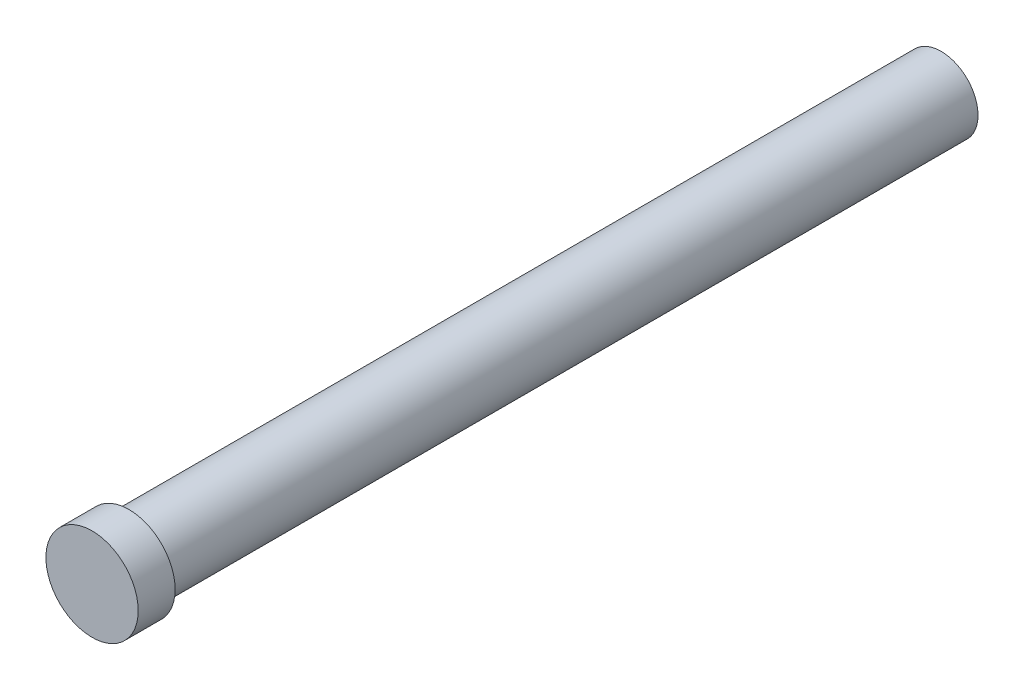
ISO-10303-21;
HEADER;
FILE_DESCRIPTION(('STEP AP214'),'2;1');
FILE_NAME('part.step','',(''),(''),'','','');
FILE_SCHEMA(('AUTOMOTIVE_DESIGN { 1 0 10303 214 1 1 1 1 }'));
ENDSEC;
DATA;
#1=APPLICATION_CONTEXT('core data for automotive mechanical design processes');
#2=APPLICATION_PROTOCOL_DEFINITION('international standard','automotive_design',2000,#1);
#3=PRODUCT_CONTEXT('',#1,'mechanical');
#4=PRODUCT('Part','Part','',(#3));
#5=PRODUCT_RELATED_PRODUCT_CATEGORY('part','',(#4));
#6=PRODUCT_DEFINITION_FORMATION('','',#4);
#7=PRODUCT_DEFINITION_CONTEXT('part definition',#1,'design');
#8=PRODUCT_DEFINITION('design','',#6,#7);
#9=PRODUCT_DEFINITION_SHAPE('','',#8);
#10=(LENGTH_UNIT() NAMED_UNIT(*) SI_UNIT(.MILLI.,.METRE.));
#11=(NAMED_UNIT(*) PLANE_ANGLE_UNIT() SI_UNIT($,.RADIAN.));
#12=(NAMED_UNIT(*) SI_UNIT($,.STERADIAN.) SOLID_ANGLE_UNIT());
#13=UNCERTAINTY_MEASURE_WITH_UNIT(LENGTH_MEASURE(1.E-05),#10,'distance_accuracy_value','');
#14=(GEOMETRIC_REPRESENTATION_CONTEXT(3) GLOBAL_UNCERTAINTY_ASSIGNED_CONTEXT((#13)) GLOBAL_UNIT_ASSIGNED_CONTEXT((#10,
#11,#12)) REPRESENTATION_CONTEXT('',''));
#15=CARTESIAN_POINT('',(0.,0.,0.));
#16=DIRECTION('',(0.,0.,1.));
#17=DIRECTION('',(1.,0.,0.));
#18=AXIS2_PLACEMENT_3D('',#15,#16,#17);
#19=CARTESIAN_POINT('',(0.,0.,22.));
#20=DIRECTION('',(0.,0.,-1.));
#21=DIRECTION('',(-1.,0.,0.));
#22=AXIS2_PLACEMENT_3D('',#19,#20,#21);
#23=CYLINDRICAL_SURFACE('',#22,1.);
#24=CARTESIAN_POINT('',(0.,0.,22.));
#25=DIRECTION('',(0.,0.,1.));
#26=DIRECTION('',(1.,0.,0.));
#27=AXIS2_PLACEMENT_3D('',#24,#25,#26);
#28=CIRCLE('',#27,1.);
#29=CARTESIAN_POINT('',(1.,0.,22.));
#30=VERTEX_POINT('',#29);
#31=EDGE_CURVE('E10',#30,#30,#28,.T.);
#32=ORIENTED_EDGE('',*,*,#31,.F.);
#33=EDGE_LOOP('',(#32));
#34=FACE_BOUND('',#33,.T.);
#35=CARTESIAN_POINT('',(0.,0.,0.));
#36=DIRECTION('',(0.,0.,1.));
#37=DIRECTION('',(1.,0.,0.));
#38=AXIS2_PLACEMENT_3D('',#35,#36,#37);
#39=CIRCLE('',#38,1.);
#40=CARTESIAN_POINT('',(1.,0.,0.));
#41=VERTEX_POINT('',#40);
#42=EDGE_CURVE('E40',#41,#41,#39,.T.);
#43=ORIENTED_EDGE('',*,*,#42,.T.);
#44=EDGE_LOOP('',(#43));
#45=FACE_BOUND('',#44,.T.);
#46=ADVANCED_FACE('F37',(#34,#45),#23,.T.);
#47=CARTESIAN_POINT('',(0.,0.,0.));
#48=DIRECTION('',(0.,0.,1.));
#49=DIRECTION('',(1.,0.,0.));
#50=AXIS2_PLACEMENT_3D('',#47,#48,#49);
#51=PLANE('',#50);
#52=ORIENTED_EDGE('',*,*,#42,.F.);
#53=EDGE_LOOP('',(#52));
#54=FACE_BOUND('',#53,.T.);
#55=ADVANCED_FACE('F64',(#54),#51,.F.);
#56=CARTESIAN_POINT('',(0.,0.,23.));
#57=DIRECTION('',(0.,0.,-1.));
#58=DIRECTION('',(-1.,0.,0.));
#59=AXIS2_PLACEMENT_3D('',#56,#57,#58);
#60=CYLINDRICAL_SURFACE('',#59,1.25);
#61=CARTESIAN_POINT('',(0.,0.,23.));
#62=DIRECTION('',(0.,0.,1.));
#63=DIRECTION('',(1.,0.,0.));
#64=AXIS2_PLACEMENT_3D('',#61,#62,#63);
#65=CIRCLE('',#64,1.25);
#66=CARTESIAN_POINT('',(1.25,0.,23.));
#67=VERTEX_POINT('',#66);
#68=EDGE_CURVE('E49',#67,#67,#65,.T.);
#69=ORIENTED_EDGE('',*,*,#68,.F.);
#70=EDGE_LOOP('',(#69));
#71=FACE_BOUND('',#70,.T.);
#72=CARTESIAN_POINT('',(0.,0.,22.));
#73=DIRECTION('',(0.,0.,1.));
#74=DIRECTION('',(1.,0.,0.));
#75=AXIS2_PLACEMENT_3D('',#72,#73,#74);
#76=CIRCLE('',#75,1.25);
#77=CARTESIAN_POINT('',(1.25,0.,22.));
#78=VERTEX_POINT('',#77);
#79=EDGE_CURVE('E51',#78,#78,#76,.T.);
#80=ORIENTED_EDGE('',*,*,#79,.T.);
#81=EDGE_LOOP('',(#80));
#82=FACE_BOUND('',#81,.T.);
#83=ADVANCED_FACE('F61',(#71,#82),#60,.T.);
#84=CARTESIAN_POINT('',(0.,0.,23.));
#85=DIRECTION('',(0.,0.,1.));
#86=DIRECTION('',(1.,0.,0.));
#87=AXIS2_PLACEMENT_3D('',#84,#85,#86);
#88=PLANE('',#87);
#89=ORIENTED_EDGE('',*,*,#68,.T.);
#90=EDGE_LOOP('',(#89));
#91=FACE_BOUND('',#90,.T.);
#92=ADVANCED_FACE('F59',(#91),#88,.T.);
#93=CARTESIAN_POINT('',(0.,0.,22.));
#94=DIRECTION('',(0.,0.,1.));
#95=DIRECTION('',(1.,0.,0.));
#96=AXIS2_PLACEMENT_3D('',#93,#94,#95);
#97=PLANE('',#96);
#98=ORIENTED_EDGE('',*,*,#31,.T.);
#99=EDGE_LOOP('',(#98));
#100=FACE_BOUND('',#99,.T.);
#101=ORIENTED_EDGE('',*,*,#79,.F.);
#102=EDGE_LOOP('',(#101));
#103=FACE_BOUND('',#102,.T.);
#104=ADVANCED_FACE('F68',(#100,#103),#97,.F.);
#105=CLOSED_SHELL('',(#46,#55,#83,#92,#104));
#106=MANIFOLD_SOLID_BREP('B2',#105);
#107=ADVANCED_BREP_SHAPE_REPRESENTATION('',(#18,#106),#14);
#108=SHAPE_DEFINITION_REPRESENTATION(#9,#107);
ENDSEC;
END-ISO-10303-21;
